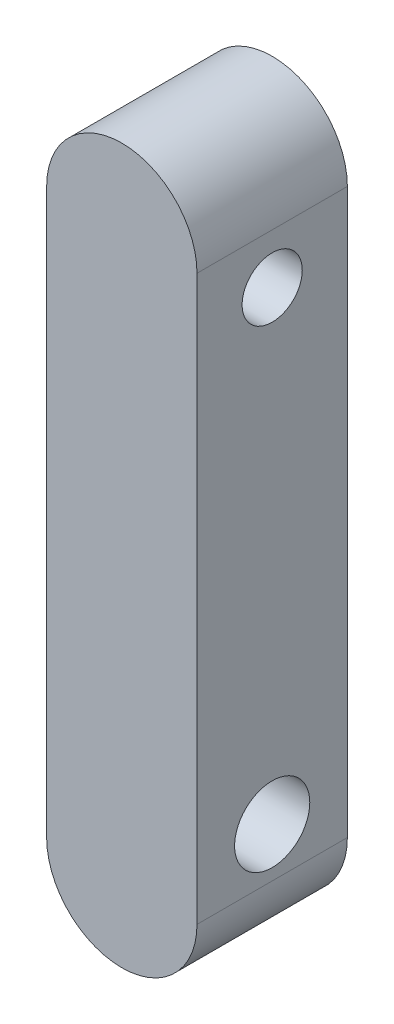
ISO-10303-21;
HEADER;
FILE_DESCRIPTION(('STEP AP214'),'2;1');
FILE_NAME('part.step','',(''),(''),'','','');
FILE_SCHEMA(('AUTOMOTIVE_DESIGN { 1 0 10303 214 1 1 1 1 }'));
ENDSEC;
DATA;
#1=APPLICATION_CONTEXT('core data for automotive mechanical design processes');
#2=APPLICATION_PROTOCOL_DEFINITION('international standard','automotive_design',2000,#1);
#3=PRODUCT_CONTEXT('',#1,'mechanical');
#4=PRODUCT('Part','Part','',(#3));
#5=PRODUCT_RELATED_PRODUCT_CATEGORY('part','',(#4));
#6=PRODUCT_DEFINITION_FORMATION('','',#4);
#7=PRODUCT_DEFINITION_CONTEXT('part definition',#1,'design');
#8=PRODUCT_DEFINITION('design','',#6,#7);
#9=PRODUCT_DEFINITION_SHAPE('','',#8);
#10=(LENGTH_UNIT() NAMED_UNIT(*) SI_UNIT(.MILLI.,.METRE.));
#11=(NAMED_UNIT(*) PLANE_ANGLE_UNIT() SI_UNIT($,.RADIAN.));
#12=(NAMED_UNIT(*) SI_UNIT($,.STERADIAN.) SOLID_ANGLE_UNIT());
#13=UNCERTAINTY_MEASURE_WITH_UNIT(LENGTH_MEASURE(1.E-05),#10,'distance_accuracy_value','');
#14=(GEOMETRIC_REPRESENTATION_CONTEXT(3) GLOBAL_UNCERTAINTY_ASSIGNED_CONTEXT((#13)) GLOBAL_UNIT_ASSIGNED_CONTEXT((#10,
#11,#12)) REPRESENTATION_CONTEXT('',''));
#15=CARTESIAN_POINT('',(0.,0.,0.));
#16=DIRECTION('',(0.,0.,1.));
#17=DIRECTION('',(1.,0.,0.));
#18=AXIS2_PLACEMENT_3D('',#15,#16,#17);
#19=CARTESIAN_POINT('',(0.,0.,20.));
#20=DIRECTION('',(0.,0.,1.));
#21=DIRECTION('',(1.,0.,0.));
#22=AXIS2_PLACEMENT_3D('',#19,#20,#21);
#23=PLANE('',#22);
#24=CARTESIAN_POINT('',(0.,0.,20.));
#25=DIRECTION('',(0.,0.,1.));
#26=DIRECTION('',(1.,0.,0.));
#27=AXIS2_PLACEMENT_3D('',#24,#25,#26);
#28=CIRCLE('',#27,10.);
#29=CARTESIAN_POINT('',(-10.,0.,20.));
#30=VERTEX_POINT('',#29);
#31=CARTESIAN_POINT('',(10.,0.,20.));
#32=VERTEX_POINT('',#31);
#33=EDGE_CURVE('E89',#30,#32,#28,.T.);
#34=ORIENTED_EDGE('',*,*,#33,.T.);
#35=DIRECTION('',(0.,1.,0.));
#36=VECTOR('',#35,1.);
#37=CARTESIAN_POINT('',(10.,0.,20.));
#38=LINE('',#37,#36);
#39=CARTESIAN_POINT('',(10.,75.,20.));
#40=VERTEX_POINT('',#39);
#41=EDGE_CURVE('E85',#32,#40,#38,.T.);
#42=ORIENTED_EDGE('',*,*,#41,.T.);
#43=CARTESIAN_POINT('',(0.,75.,20.));
#44=DIRECTION('',(0.,0.,1.));
#45=DIRECTION('',(1.,0.,0.));
#46=AXIS2_PLACEMENT_3D('',#43,#44,#45);
#47=CIRCLE('',#46,10.);
#48=CARTESIAN_POINT('',(-10.,75.,20.));
#49=VERTEX_POINT('',#48);
#50=EDGE_CURVE('E87',#40,#49,#47,.T.);
#51=ORIENTED_EDGE('',*,*,#50,.T.);
#52=DIRECTION('',(0.,-1.,0.));
#53=VECTOR('',#52,1.);
#54=CARTESIAN_POINT('',(-10.,0.,20.));
#55=LINE('',#54,#53);
#56=EDGE_CURVE('E55',#49,#30,#55,.T.);
#57=ORIENTED_EDGE('',*,*,#56,.T.);
#58=EDGE_LOOP('',(#34,#42,#51,#57));
#59=FACE_BOUND('',#58,.T.);
#60=ADVANCED_FACE('F37',(#59),#23,.T.);
#61=CARTESIAN_POINT('',(0.,0.,0.));
#62=DIRECTION('',(0.,0.,1.));
#63=DIRECTION('',(1.,0.,0.));
#64=AXIS2_PLACEMENT_3D('',#61,#62,#63);
#65=PLANE('',#64);
#66=CARTESIAN_POINT('',(0.,0.,0.));
#67=DIRECTION('',(0.,0.,1.));
#68=DIRECTION('',(1.,0.,0.));
#69=AXIS2_PLACEMENT_3D('',#66,#67,#68);
#70=CIRCLE('',#69,10.);
#71=CARTESIAN_POINT('',(-10.,0.,0.));
#72=VERTEX_POINT('',#71);
#73=CARTESIAN_POINT('',(10.,0.,0.));
#74=VERTEX_POINT('',#73);
#75=EDGE_CURVE('E102',#72,#74,#70,.T.);
#76=ORIENTED_EDGE('',*,*,#75,.F.);
#77=DIRECTION('',(0.,-1.,0.));
#78=VECTOR('',#77,1.);
#79=CARTESIAN_POINT('',(-10.,0.,0.));
#80=LINE('',#79,#78);
#81=CARTESIAN_POINT('',(-10.,75.,0.));
#82=VERTEX_POINT('',#81);
#83=EDGE_CURVE('E78',#82,#72,#80,.T.);
#84=ORIENTED_EDGE('',*,*,#83,.F.);
#85=CARTESIAN_POINT('',(0.,75.,0.));
#86=DIRECTION('',(0.,0.,1.));
#87=DIRECTION('',(1.,0.,0.));
#88=AXIS2_PLACEMENT_3D('',#85,#86,#87);
#89=CIRCLE('',#88,10.);
#90=CARTESIAN_POINT('',(10.,75.,0.));
#91=VERTEX_POINT('',#90);
#92=EDGE_CURVE('E72',#91,#82,#89,.T.);
#93=ORIENTED_EDGE('',*,*,#92,.F.);
#94=DIRECTION('',(0.,1.,0.));
#95=VECTOR('',#94,1.);
#96=CARTESIAN_POINT('',(10.,0.,0.));
#97=LINE('',#96,#95);
#98=EDGE_CURVE('E93',#74,#91,#97,.T.);
#99=ORIENTED_EDGE('',*,*,#98,.F.);
#100=EDGE_LOOP('',(#76,#84,#93,#99));
#101=FACE_BOUND('',#100,.T.);
#102=ADVANCED_FACE('F112',(#101),#65,.F.);
#103=CARTESIAN_POINT('',(0.,0.,20.));
#104=DIRECTION('',(0.,0.,-1.));
#105=DIRECTION('',(-1.,0.,0.));
#106=AXIS2_PLACEMENT_3D('',#103,#104,#105);
#107=CYLINDRICAL_SURFACE('',#106,10.);
#108=ORIENTED_EDGE('',*,*,#75,.T.);
#109=DIRECTION('',(0.,0.,-1.));
#110=VECTOR('',#109,1.);
#111=CARTESIAN_POINT('',(10.,0.,20.));
#112=LINE('',#111,#110);
#113=EDGE_CURVE('E11',#32,#74,#112,.T.);
#114=ORIENTED_EDGE('',*,*,#113,.F.);
#115=ORIENTED_EDGE('',*,*,#33,.F.);
#116=DIRECTION('',(0.,0.,-1.));
#117=VECTOR('',#116,1.);
#118=CARTESIAN_POINT('',(-10.,0.,20.));
#119=LINE('',#118,#117);
#120=EDGE_CURVE('E98',#30,#72,#119,.T.);
#121=ORIENTED_EDGE('',*,*,#120,.T.);
#122=EDGE_LOOP('',(#108,#114,#115,#121));
#123=FACE_BOUND('',#122,.T.);
#124=ADVANCED_FACE('F39',(#123),#107,.T.);
#125=CARTESIAN_POINT('',(10.,0.,20.));
#126=DIRECTION('',(-1.,0.,0.));
#127=DIRECTION('',(0.,0.,1.));
#128=AXIS2_PLACEMENT_3D('',#125,#126,#127);
#129=PLANE('',#128);
#130=CARTESIAN_POINT('',(10.,6.54,10.));
#131=DIRECTION('',(1.,0.,0.));
#132=DIRECTION('',(0.,0.,-1.));
#133=AXIS2_PLACEMENT_3D('',#130,#131,#132);
#134=CIRCLE('',#133,5.);
#135=CARTESIAN_POINT('',(10.,6.54,5.));
#136=VERTEX_POINT('',#135);
#137=EDGE_CURVE('E121',#136,#136,#134,.T.);
#138=ORIENTED_EDGE('',*,*,#137,.F.);
#139=EDGE_LOOP('',(#138));
#140=FACE_BOUND('',#139,.T.);
#141=CARTESIAN_POINT('',(10.,68.36,10.));
#142=DIRECTION('',(1.,0.,0.));
#143=DIRECTION('',(0.,0.,-1.));
#144=AXIS2_PLACEMENT_3D('',#141,#142,#143);
#145=CIRCLE('',#144,4.);
#146=CARTESIAN_POINT('',(10.,68.36,6.));
#147=VERTEX_POINT('',#146);
#148=EDGE_CURVE('E115',#147,#147,#145,.T.);
#149=ORIENTED_EDGE('',*,*,#148,.F.);
#150=EDGE_LOOP('',(#149));
#151=FACE_BOUND('',#150,.T.);
#152=ORIENTED_EDGE('',*,*,#98,.T.);
#153=DIRECTION('',(0.,0.,-1.));
#154=VECTOR('',#153,1.);
#155=CARTESIAN_POINT('',(10.,75.,20.));
#156=LINE('',#155,#154);
#157=EDGE_CURVE('E47',#40,#91,#156,.T.);
#158=ORIENTED_EDGE('',*,*,#157,.F.);
#159=ORIENTED_EDGE('',*,*,#41,.F.);
#160=ORIENTED_EDGE('',*,*,#113,.T.);
#161=EDGE_LOOP('',(#152,#158,#159,#160));
#162=FACE_BOUND('',#161,.T.);
#163=ADVANCED_FACE('F92',(#140,#151,#162),#129,.F.);
#164=CARTESIAN_POINT('',(0.,75.,20.));
#165=DIRECTION('',(0.,0.,-1.));
#166=DIRECTION('',(-1.,0.,0.));
#167=AXIS2_PLACEMENT_3D('',#164,#165,#166);
#168=CYLINDRICAL_SURFACE('',#167,10.);
#169=ORIENTED_EDGE('',*,*,#92,.T.);
#170=DIRECTION('',(0.,0.,-1.));
#171=VECTOR('',#170,1.);
#172=CARTESIAN_POINT('',(-10.,75.,20.));
#173=LINE('',#172,#171);
#174=EDGE_CURVE('E94',#49,#82,#173,.T.);
#175=ORIENTED_EDGE('',*,*,#174,.F.);
#176=ORIENTED_EDGE('',*,*,#50,.F.);
#177=ORIENTED_EDGE('',*,*,#157,.T.);
#178=EDGE_LOOP('',(#169,#175,#176,#177));
#179=FACE_BOUND('',#178,.T.);
#180=ADVANCED_FACE('F96',(#179),#168,.T.);
#181=CARTESIAN_POINT('',(-10.,0.,20.));
#182=DIRECTION('',(1.,0.,0.));
#183=DIRECTION('',(0.,0.,-1.));
#184=AXIS2_PLACEMENT_3D('',#181,#182,#183);
#185=PLANE('',#184);
#186=CARTESIAN_POINT('',(-10.,6.54,10.));
#187=DIRECTION('',(1.,0.,0.));
#188=DIRECTION('',(0.,0.,-1.));
#189=AXIS2_PLACEMENT_3D('',#186,#187,#188);
#190=CIRCLE('',#189,5.);
#191=CARTESIAN_POINT('',(-10.,6.54,5.));
#192=VERTEX_POINT('',#191);
#193=EDGE_CURVE('E118',#192,#192,#190,.T.);
#194=ORIENTED_EDGE('',*,*,#193,.T.);
#195=EDGE_LOOP('',(#194));
#196=FACE_BOUND('',#195,.T.);
#197=CARTESIAN_POINT('',(-10.,68.36,10.));
#198=DIRECTION('',(1.,0.,0.));
#199=DIRECTION('',(0.,0.,-1.));
#200=AXIS2_PLACEMENT_3D('',#197,#198,#199);
#201=CIRCLE('',#200,4.);
#202=CARTESIAN_POINT('',(-10.,68.36,6.));
#203=VERTEX_POINT('',#202);
#204=EDGE_CURVE('E41',#203,#203,#201,.T.);
#205=ORIENTED_EDGE('',*,*,#204,.T.);
#206=EDGE_LOOP('',(#205));
#207=FACE_BOUND('',#206,.T.);
#208=ORIENTED_EDGE('',*,*,#83,.T.);
#209=ORIENTED_EDGE('',*,*,#120,.F.);
#210=ORIENTED_EDGE('',*,*,#56,.F.);
#211=ORIENTED_EDGE('',*,*,#174,.T.);
#212=EDGE_LOOP('',(#208,#209,#210,#211));
#213=FACE_BOUND('',#212,.T.);
#214=ADVANCED_FACE('F109',(#196,#207,#213),#185,.F.);
#215=CARTESIAN_POINT('',(-18.,68.36,10.));
#216=DIRECTION('',(1.,0.,0.));
#217=DIRECTION('',(0.,0.,-1.));
#218=AXIS2_PLACEMENT_3D('',#215,#216,#217);
#219=CYLINDRICAL_SURFACE('',#218,4.);
#220=ORIENTED_EDGE('',*,*,#148,.T.);
#221=EDGE_LOOP('',(#220));
#222=FACE_BOUND('',#221,.T.);
#223=ORIENTED_EDGE('',*,*,#204,.F.);
#224=EDGE_LOOP('',(#223));
#225=FACE_BOUND('',#224,.T.);
#226=ADVANCED_FACE('F132',(#222,#225),#219,.F.);
#227=CARTESIAN_POINT('',(-20.,6.54,10.));
#228=DIRECTION('',(1.,0.,0.));
#229=DIRECTION('',(0.,0.,-1.));
#230=AXIS2_PLACEMENT_3D('',#227,#228,#229);
#231=CYLINDRICAL_SURFACE('',#230,5.);
#232=ORIENTED_EDGE('',*,*,#137,.T.);
#233=EDGE_LOOP('',(#232));
#234=FACE_BOUND('',#233,.T.);
#235=ORIENTED_EDGE('',*,*,#193,.F.);
#236=EDGE_LOOP('',(#235));
#237=FACE_BOUND('',#236,.T.);
#238=ADVANCED_FACE('F125',(#234,#237),#231,.F.);
#239=CLOSED_SHELL('',(#60,#102,#124,#163,#180,#214,#226,#238));
#240=MANIFOLD_SOLID_BREP('B2',#239);
#241=ADVANCED_BREP_SHAPE_REPRESENTATION('',(#18,#240),#14);
#242=SHAPE_DEFINITION_REPRESENTATION(#9,#241);
ENDSEC;
END-ISO-10303-21;
